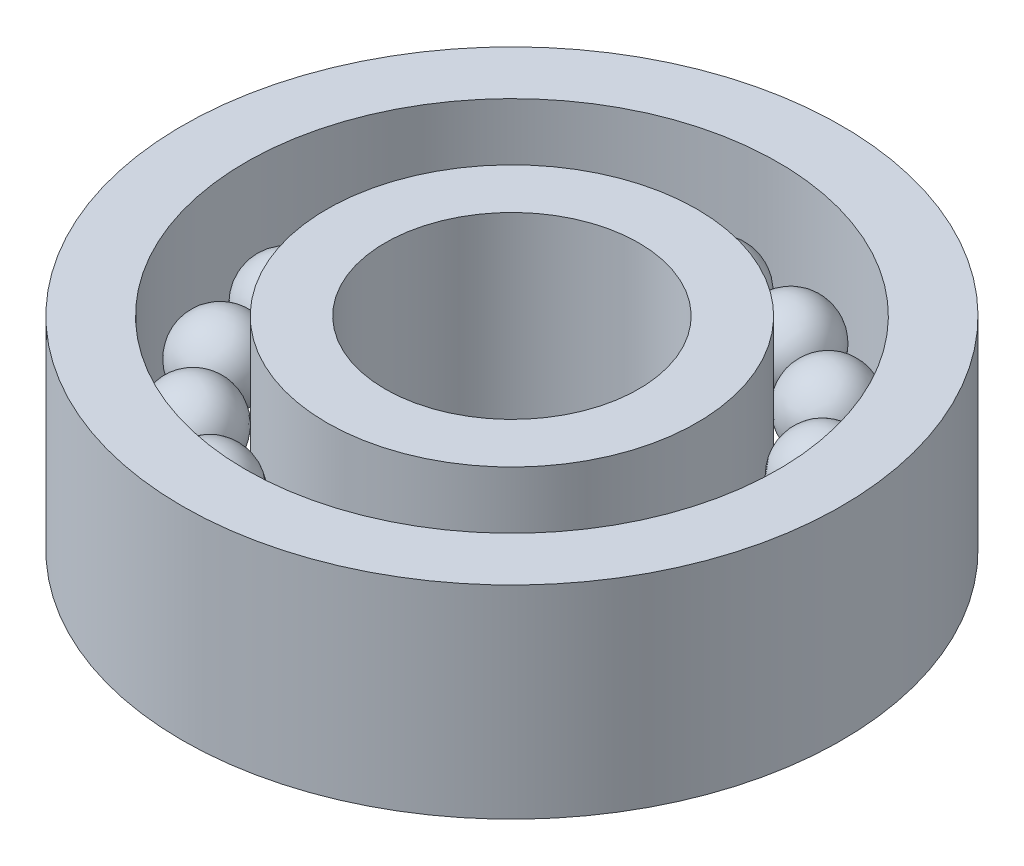
ISO-10303-21;
HEADER;
FILE_DESCRIPTION(('STEP AP214'),'2;1');
FILE_NAME('part.step','',(''),(''),'','','');
FILE_SCHEMA(('AUTOMOTIVE_DESIGN { 1 0 10303 214 1 1 1 1 }'));
ENDSEC;
DATA;
#1=APPLICATION_CONTEXT('core data for automotive mechanical design processes');
#2=APPLICATION_PROTOCOL_DEFINITION('international standard','automotive_design',2000,#1);
#3=PRODUCT_CONTEXT('',#1,'mechanical');
#4=PRODUCT('Part','Part','',(#3));
#5=PRODUCT_RELATED_PRODUCT_CATEGORY('part','',(#4));
#6=PRODUCT_DEFINITION_FORMATION('','',#4);
#7=PRODUCT_DEFINITION_CONTEXT('part definition',#1,'design');
#8=PRODUCT_DEFINITION('design','',#6,#7);
#9=PRODUCT_DEFINITION_SHAPE('','',#8);
#10=(LENGTH_UNIT() NAMED_UNIT(*) SI_UNIT(.MILLI.,.METRE.));
#11=(NAMED_UNIT(*) PLANE_ANGLE_UNIT() SI_UNIT($,.RADIAN.));
#12=(NAMED_UNIT(*) SI_UNIT($,.STERADIAN.) SOLID_ANGLE_UNIT());
#13=UNCERTAINTY_MEASURE_WITH_UNIT(LENGTH_MEASURE(1.E-05),#10,'distance_accuracy_value','');
#14=(GEOMETRIC_REPRESENTATION_CONTEXT(3) GLOBAL_UNCERTAINTY_ASSIGNED_CONTEXT((#13)) GLOBAL_UNIT_ASSIGNED_CONTEXT((#10,
#11,#12)) REPRESENTATION_CONTEXT('',''));
#15=CARTESIAN_POINT('',(0.,0.,0.));
#16=DIRECTION('',(0.,0.,1.));
#17=DIRECTION('',(1.,0.,0.));
#18=AXIS2_PLACEMENT_3D('',#15,#16,#17);
#19=CARTESIAN_POINT('',(-4.1495014208494,0.,1.60752541453278));
#20=DIRECTION('',(-0.361241666187141,0.,-0.932472229404361));
#21=DIRECTION('',(0.932472229404361,0.,-0.361241666187141));
#22=AXIS2_PLACEMENT_3D('',#19,#20,#21);
#23=SPHERICAL_SURFACE('',#22,0.8);
#24=CARTESIAN_POINT('',(-4.43849475379912,0.,0.861547631009287));
#25=VERTEX_POINT('',#24);
#26=VERTEX_LOOP('',#25);
#27=FACE_BOUND('',#26,.T.);
#28=ADVANCED_FACE('F54',(#27),#23,.T.);
#29=CLOSED_SHELL('',(#28));
#30=MANIFOLD_SOLID_BREP('B2',#29);
#31=CARTESIAN_POINT('',(-3.28858968163197,0.,2.99794561422714));
#32=DIRECTION('',(-0.673695643646548,0.,-0.739008917220668));
#33=DIRECTION('',(0.739008917220668,0.,-0.673695643646548));
#34=AXIS2_PLACEMENT_3D('',#31,#32,#33);
#35=SPHERICAL_SURFACE('',#34,0.8);
#36=CARTESIAN_POINT('',(-3.82754619654921,0.,2.4067384804506));
#37=VERTEX_POINT('',#36);
#38=VERTEX_LOOP('',#37);
#39=FACE_BOUND('',#38,.T.);
#40=ADVANCED_FACE('F73',(#39),#35,.T.);
#41=CLOSED_SHELL('',(#40));
#42=MANIFOLD_SOLID_BREP('B7',#41);
#43=CARTESIAN_POINT('',(-1.98353568320564,0.,3.98347664653));
#44=DIRECTION('',(-0.895163291355057,0.,-0.445738355776549));
#45=DIRECTION('',(0.445738355776549,0.,-0.895163291355057));
#46=AXIS2_PLACEMENT_3D('',#43,#44,#45);
#47=SPHERICAL_SURFACE('',#46,0.8);
#48=CARTESIAN_POINT('',(-2.69966631628969,0.,3.62688596190876));
#49=VERTEX_POINT('',#48);
#50=VERTEX_LOOP('',#49);
#51=FACE_BOUND('',#50,.T.);
#52=ADVANCED_FACE('F92',(#51),#47,.T.);
#53=CLOSED_SHELL('',(#52));
#54=MANIFOLD_SOLID_BREP('B50',#53);
#55=CARTESIAN_POINT('',(-0.410594199611743,0.,4.4310170845129));
#56=DIRECTION('',(-0.995734176295033,0.,-0.092268359463313));
#57=DIRECTION('',(0.092268359463313,0.,-0.995734176295033));
#58=AXIS2_PLACEMENT_3D('',#55,#56,#57);
#59=SPHERICAL_SURFACE('',#58,0.8);
#60=CARTESIAN_POINT('',(-1.20718154064777,0.,4.35720239694225));
#61=VERTEX_POINT('',#60);
#62=VERTEX_LOOP('',#61);
#63=FACE_BOUND('',#62,.T.);
#64=ADVANCED_FACE('F111',(#63),#59,.T.);
#65=CLOSED_SHELL('',(#64));
#66=MANIFOLD_SOLID_BREP('B69',#65);
#67=CARTESIAN_POINT('',(1.21780030582072,0.,4.28012411211906));
#68=DIRECTION('',(-0.961825643172822,0.,0.273662990072073));
#69=DIRECTION('',(-0.273662990072073,0.,-0.961825643172822));
#70=AXIS2_PLACEMENT_3D('',#67,#68,#69);
#71=SPHERICAL_SURFACE('',#70,0.8);
#72=CARTESIAN_POINT('',(0.448339791282467,0.,4.49905450417672));
#73=VERTEX_POINT('',#72);
#74=VERTEX_LOOP('',#73);
#75=FACE_BOUND('',#74,.T.);
#76=ADVANCED_FACE('F130',(#75),#71,.T.);
#77=CLOSED_SHELL('',(#76));
#78=MANIFOLD_SOLID_BREP('B88',#77);
#79=CARTESIAN_POINT('',(2.68172413188766,0.,3.55117666139709));
#80=DIRECTION('',(-0.798017227280245,0.,0.602634636379249));
#81=DIRECTION('',(-0.602634636379249,0.,-0.798017227280245));
#82=AXIS2_PLACEMENT_3D('',#79,#80,#81);
#83=SPHERICAL_SURFACE('',#82,0.8);
#84=CARTESIAN_POINT('',(2.04331035006346,0.,4.03328437050049));
#85=VERTEX_POINT('',#84);
#86=VERTEX_LOOP('',#85);
#87=FACE_BOUND('',#86,.T.);
#88=ADVANCED_FACE('F149',(#87),#83,.T.);
#89=CLOSED_SHELL('',(#88));
#90=MANIFOLD_SOLID_BREP('B107',#89);
#91=CARTESIAN_POINT('',(3.78346625399677,0.,2.34262312480426));
#92=DIRECTION('',(-0.526432162877363,0.,0.85021713572961));
#93=DIRECTION('',(-0.85021713572961,0.,-0.526432162877363));
#94=AXIS2_PLACEMENT_3D('',#91,#92,#93);
#95=SPHERICAL_SURFACE('',#94,0.8);
#96=CARTESIAN_POINT('',(3.36232052369487,0.,3.02279683338795));
#97=VERTEX_POINT('',#96);
#98=VERTEX_LOOP('',#97);
#99=FACE_BOUND('',#98,.T.);
#100=ADVANCED_FACE('F168',(#99),#95,.T.);
#101=CLOSED_SHELL('',(#100));
#102=MANIFOLD_SOLID_BREP('B126',#101);
#103=CARTESIAN_POINT('',(4.37423029359336,0.,0.81768535428377));
#104=DIRECTION('',(-0.183749517816578,0.,0.9829730996839));
#105=DIRECTION('',(-0.9829730996839,0.,-0.183749517816578));
#106=AXIS2_PLACEMENT_3D('',#103,#104,#105);
#107=SPHERICAL_SURFACE('',#106,0.8);
#108=CARTESIAN_POINT('',(4.22723067934009,0.,1.60406383403089));
#109=VERTEX_POINT('',#108);
#110=VERTEX_LOOP('',#109);
#111=FACE_BOUND('',#110,.T.);
#112=ADVANCED_FACE('F187',(#111),#107,.T.);
#113=CLOSED_SHELL('',(#112));
#114=MANIFOLD_SOLID_BREP('B145',#113);
#115=CARTESIAN_POINT('',(4.37423029359337,0.,-0.817685354283709));
#116=DIRECTION('',(0.183749517816564,0.,0.982973099683903));
#117=DIRECTION('',(-0.982973099683903,0.,0.183749517816564));
#118=AXIS2_PLACEMENT_3D('',#115,#116,#117);
#119=SPHERICAL_SURFACE('',#118,0.8);
#120=CARTESIAN_POINT('',(4.52122990784662,0.,-0.0313068745365865));
#121=VERTEX_POINT('',#120);
#122=VERTEX_LOOP('',#121);
#123=FACE_BOUND('',#122,.T.);
#124=ADVANCED_FACE('F206',(#123),#119,.T.);
#125=CLOSED_SHELL('',(#124));
#126=MANIFOLD_SOLID_BREP('B164',#125);
#127=CARTESIAN_POINT('',(3.7834662539968,0.,-2.34262312480421));
#128=DIRECTION('',(0.526432162877351,0.,0.850217135729617));
#129=DIRECTION('',(-0.850217135729617,0.,0.526432162877351));
#130=AXIS2_PLACEMENT_3D('',#127,#128,#129);
#131=SPHERICAL_SURFACE('',#130,0.8);
#132=CARTESIAN_POINT('',(4.20461198429868,0.,-1.66244941622052));
#133=VERTEX_POINT('',#132);
#134=VERTEX_LOOP('',#133);
#135=FACE_BOUND('',#134,.T.);
#136=ADVANCED_FACE('F225',(#135),#131,.T.);
#137=CLOSED_SHELL('',(#136));
#138=MANIFOLD_SOLID_BREP('B183',#137);
#139=CARTESIAN_POINT('',(2.68172413188771,0.,-3.55117666139705));
#140=DIRECTION('',(0.798017227280236,0.,0.602634636379261));
#141=DIRECTION('',(-0.602634636379261,0.,0.798017227280236));
#142=AXIS2_PLACEMENT_3D('',#139,#140,#141);
#143=SPHERICAL_SURFACE('',#142,0.8);
#144=CARTESIAN_POINT('',(3.3201379137119,0.,-3.06906895229364));
#145=VERTEX_POINT('',#144);
#146=VERTEX_LOOP('',#145);
#147=FACE_BOUND('',#146,.T.);
#148=ADVANCED_FACE('F244',(#147),#143,.T.);
#149=CLOSED_SHELL('',(#148));
#150=MANIFOLD_SOLID_BREP('B202',#149);
#151=CARTESIAN_POINT('',(1.21780030582079,0.,-4.28012411211904));
#152=DIRECTION('',(0.961825643172818,0.,0.273662990072087));
#153=DIRECTION('',(-0.273662990072087,0.,0.961825643172818));
#154=AXIS2_PLACEMENT_3D('',#151,#152,#153);
#155=SPHERICAL_SURFACE('',#154,0.8);
#156=CARTESIAN_POINT('',(1.98726082035904,0.,-4.06119372006137));
#157=VERTEX_POINT('',#156);
#158=VERTEX_LOOP('',#157);
#159=FACE_BOUND('',#158,.T.);
#160=ADVANCED_FACE('F263',(#159),#155,.T.);
#161=CLOSED_SHELL('',(#160));
#162=MANIFOLD_SOLID_BREP('B221',#161);
#163=CARTESIAN_POINT('',(-0.410594199611679,0.,-4.43101708451291));
#164=DIRECTION('',(0.995734176295035,0.,-0.0922683594632987));
#165=DIRECTION('',(0.0922683594632987,0.,0.995734176295035));
#166=AXIS2_PLACEMENT_3D('',#163,#164,#165);
#167=SPHERICAL_SURFACE('',#166,0.8);
#168=CARTESIAN_POINT('',(0.385993141424349,0.,-4.50483177208354));
#169=VERTEX_POINT('',#168);
#170=VERTEX_LOOP('',#169);
#171=FACE_BOUND('',#170,.T.);
#172=ADVANCED_FACE('F282',(#171),#167,.T.);
#173=CLOSED_SHELL('',(#172));
#174=MANIFOLD_SOLID_BREP('B240',#173);
#175=CARTESIAN_POINT('',(-1.98353568320558,0.,-3.98347664653003));
#176=DIRECTION('',(0.895163291355063,0.,-0.445738355776536));
#177=DIRECTION('',(0.445738355776536,0.,0.895163291355063));
#178=AXIS2_PLACEMENT_3D('',#175,#176,#177);
#179=SPHERICAL_SURFACE('',#178,0.8);
#180=CARTESIAN_POINT('',(-1.26740505012153,0.,-4.34006733115126));
#181=VERTEX_POINT('',#180);
#182=VERTEX_LOOP('',#181);
#183=FACE_BOUND('',#182,.T.);
#184=ADVANCED_FACE('F301',(#183),#179,.T.);
#185=CLOSED_SHELL('',(#184));
#186=MANIFOLD_SOLID_BREP('B259',#185);
#187=CARTESIAN_POINT('',(-3.28858968163193,0.,-2.99794561422718));
#188=DIRECTION('',(0.673695643646558,0.,-0.739008917220658));
#189=DIRECTION('',(0.739008917220658,0.,0.673695643646558));
#190=AXIS2_PLACEMENT_3D('',#187,#188,#189);
#191=SPHERICAL_SURFACE('',#190,0.8);
#192=CARTESIAN_POINT('',(-2.74963316671468,0.,-3.58915274800371));
#193=VERTEX_POINT('',#192);
#194=VERTEX_LOOP('',#193);
#195=FACE_BOUND('',#194,.T.);
#196=ADVANCED_FACE('F320',(#195),#191,.T.);
#197=CLOSED_SHELL('',(#196));
#198=MANIFOLD_SOLID_BREP('B278',#197);
#199=CARTESIAN_POINT('',(-4.14950142084938,0.,-1.60752541453283));
#200=DIRECTION('',(0.361241666187154,0.,-0.932472229404355));
#201=DIRECTION('',(0.932472229404355,0.,0.361241666187154));
#202=AXIS2_PLACEMENT_3D('',#199,#200,#201);
#203=SPHERICAL_SURFACE('',#202,0.8);
#204=CARTESIAN_POINT('',(-3.86050808789966,0.,-2.35350319805632));
#205=VERTEX_POINT('',#204);
#206=VERTEX_LOOP('',#205);
#207=FACE_BOUND('',#206,.T.);
#208=ADVANCED_FACE('F339',(#207),#203,.T.);
#209=CLOSED_SHELL('',(#208));
#210=MANIFOLD_SOLID_BREP('B297',#209);
#211=CARTESIAN_POINT('',(-4.45,0.,0.));
#212=DIRECTION('',(0.,0.,-1.));
#213=DIRECTION('',(1.,0.,0.));
#214=AXIS2_PLACEMENT_3D('',#211,#212,#213);
#215=SPHERICAL_SURFACE('',#214,0.8);
#216=CARTESIAN_POINT('',(-4.45,0.,-0.8));
#217=VERTEX_POINT('',#216);
#218=VERTEX_LOOP('',#217);
#219=FACE_BOUND('',#218,.T.);
#220=ADVANCED_FACE('F362',(#219),#215,.T.);
#221=CLOSED_SHELL('',(#220));
#222=MANIFOLD_SOLID_BREP('B316',#221);
#223=CARTESIAN_POINT('',(0.,2.,0.));
#224=DIRECTION('',(0.,1.,0.));
#225=DIRECTION('',(0.,0.,1.));
#226=AXIS2_PLACEMENT_3D('',#223,#224,#225);
#227=PLANE('',#226);
#228=CARTESIAN_POINT('',(0.,2.,0.));
#229=DIRECTION('',(0.,1.,0.));
#230=DIRECTION('',(0.,0.,1.));
#231=AXIS2_PLACEMENT_3D('',#228,#229,#230);
#232=CIRCLE('',#231,5.25);
#233=CARTESIAN_POINT('',(0.,2.,5.25));
#234=VERTEX_POINT('',#233);
#235=EDGE_CURVE('E360',#234,#234,#232,.T.);
#236=ORIENTED_EDGE('',*,*,#235,.F.);
#237=EDGE_LOOP('',(#236));
#238=FACE_BOUND('',#237,.T.);
#239=CARTESIAN_POINT('',(0.,2.,0.));
#240=DIRECTION('',(0.,1.,0.));
#241=DIRECTION('',(0.,0.,1.));
#242=AXIS2_PLACEMENT_3D('',#239,#240,#241);
#243=CIRCLE('',#242,6.5);
#244=CARTESIAN_POINT('',(0.,2.,6.5));
#245=VERTEX_POINT('',#244);
#246=EDGE_CURVE('E410',#245,#245,#243,.T.);
#247=ORIENTED_EDGE('',*,*,#246,.T.);
#248=EDGE_LOOP('',(#247));
#249=FACE_BOUND('',#248,.T.);
#250=ADVANCED_FACE('F384',(#238,#249),#227,.T.);
#251=CARTESIAN_POINT('',(0.,-2.,0.));
#252=DIRECTION('',(0.,1.,0.));
#253=DIRECTION('',(0.,0.,1.));
#254=AXIS2_PLACEMENT_3D('',#251,#252,#253);
#255=PLANE('',#254);
#256=CARTESIAN_POINT('',(0.,-2.,0.));
#257=DIRECTION('',(0.,1.,0.));
#258=DIRECTION('',(0.,0.,1.));
#259=AXIS2_PLACEMENT_3D('',#256,#257,#258);
#260=CIRCLE('',#259,5.25);
#261=CARTESIAN_POINT('',(0.,-2.,5.25));
#262=VERTEX_POINT('',#261);
#263=EDGE_CURVE('E388',#262,#262,#260,.T.);
#264=ORIENTED_EDGE('',*,*,#263,.T.);
#265=EDGE_LOOP('',(#264));
#266=FACE_BOUND('',#265,.T.);
#267=CARTESIAN_POINT('',(0.,-2.,0.));
#268=DIRECTION('',(0.,1.,0.));
#269=DIRECTION('',(0.,0.,1.));
#270=AXIS2_PLACEMENT_3D('',#267,#268,#269);
#271=CIRCLE('',#270,6.5);
#272=CARTESIAN_POINT('',(0.,-2.,6.5));
#273=VERTEX_POINT('',#272);
#274=EDGE_CURVE('E393',#273,#273,#271,.T.);
#275=ORIENTED_EDGE('',*,*,#274,.F.);
#276=EDGE_LOOP('',(#275));
#277=FACE_BOUND('',#276,.T.);
#278=ADVANCED_FACE('F386',(#266,#277),#255,.F.);
#279=CARTESIAN_POINT('',(0.,2.,0.));
#280=DIRECTION('',(0.,-1.,0.));
#281=DIRECTION('',(0.,0.,-1.));
#282=AXIS2_PLACEMENT_3D('',#279,#280,#281);
#283=CYLINDRICAL_SURFACE('',#282,6.5);
#284=ORIENTED_EDGE('',*,*,#246,.F.);
#285=EDGE_LOOP('',(#284));
#286=FACE_BOUND('',#285,.T.);
#287=ORIENTED_EDGE('',*,*,#274,.T.);
#288=EDGE_LOOP('',(#287));
#289=FACE_BOUND('',#288,.T.);
#290=ADVANCED_FACE('F399',(#286,#289),#283,.T.);
#291=CARTESIAN_POINT('',(0.,-2.,0.));
#292=DIRECTION('',(0.,1.,0.));
#293=DIRECTION('',(0.,0.,1.));
#294=AXIS2_PLACEMENT_3D('',#291,#292,#293);
#295=CYLINDRICAL_SURFACE('',#294,5.25);
#296=CARTESIAN_POINT('',(-5.25,0.,0.));
#297=VERTEX_POINT('',#296);
#298=VERTEX_LOOP('',#297);
#299=FACE_BOUND('',#298,.T.);
#300=ORIENTED_EDGE('',*,*,#263,.F.);
#301=EDGE_LOOP('',(#300));
#302=FACE_BOUND('',#301,.T.);
#303=ORIENTED_EDGE('',*,*,#235,.T.);
#304=EDGE_LOOP('',(#303));
#305=FACE_BOUND('',#304,.T.);
#306=ADVANCED_FACE('F396',(#299,#302,#305),#295,.F.);
#307=CLOSED_SHELL('',(#250,#278,#290,#306));
#308=MANIFOLD_SOLID_BREP('B335',#307);
#309=CARTESIAN_POINT('',(0.,2.,0.));
#310=DIRECTION('',(0.,1.,0.));
#311=DIRECTION('',(0.,0.,1.));
#312=AXIS2_PLACEMENT_3D('',#309,#310,#311);
#313=PLANE('',#312);
#314=CARTESIAN_POINT('',(0.,2.,0.));
#315=DIRECTION('',(0.,1.,0.));
#316=DIRECTION('',(0.,0.,1.));
#317=AXIS2_PLACEMENT_3D('',#314,#315,#316);
#318=CIRCLE('',#317,2.5);
#319=CARTESIAN_POINT('',(0.,2.,2.5));
#320=VERTEX_POINT('',#319);
#321=EDGE_CURVE('E382',#320,#320,#318,.T.);
#322=ORIENTED_EDGE('',*,*,#321,.F.);
#323=EDGE_LOOP('',(#322));
#324=FACE_BOUND('',#323,.T.);
#325=CARTESIAN_POINT('',(0.,2.,0.));
#326=DIRECTION('',(0.,1.,0.));
#327=DIRECTION('',(0.,0.,1.));
#328=AXIS2_PLACEMENT_3D('',#325,#326,#327);
#329=CIRCLE('',#328,3.65);
#330=CARTESIAN_POINT('',(0.,2.,3.65));
#331=VERTEX_POINT('',#330);
#332=EDGE_CURVE('E470',#331,#331,#329,.T.);
#333=ORIENTED_EDGE('',*,*,#332,.T.);
#334=EDGE_LOOP('',(#333));
#335=FACE_BOUND('',#334,.T.);
#336=ADVANCED_FACE('F450',(#324,#335),#313,.T.);
#337=CARTESIAN_POINT('',(0.,2.,0.));
#338=DIRECTION('',(0.,-1.,0.));
#339=DIRECTION('',(0.,0.,-1.));
#340=AXIS2_PLACEMENT_3D('',#337,#338,#339);
#341=CYLINDRICAL_SURFACE('',#340,2.5);
#342=ORIENTED_EDGE('',*,*,#321,.T.);
#343=EDGE_LOOP('',(#342));
#344=FACE_BOUND('',#343,.T.);
#345=CARTESIAN_POINT('',(0.,-2.,0.));
#346=DIRECTION('',(0.,1.,0.));
#347=DIRECTION('',(0.,0.,1.));
#348=AXIS2_PLACEMENT_3D('',#345,#346,#347);
#349=CIRCLE('',#348,2.5);
#350=CARTESIAN_POINT('',(0.,-2.,2.5));
#351=VERTEX_POINT('',#350);
#352=EDGE_CURVE('E454',#351,#351,#349,.T.);
#353=ORIENTED_EDGE('',*,*,#352,.F.);
#354=EDGE_LOOP('',(#353));
#355=FACE_BOUND('',#354,.T.);
#356=ADVANCED_FACE('F479',(#344,#355),#341,.F.);
#357=CARTESIAN_POINT('',(0.,-2.,0.));
#358=DIRECTION('',(0.,1.,0.));
#359=DIRECTION('',(0.,0.,1.));
#360=AXIS2_PLACEMENT_3D('',#357,#358,#359);
#361=PLANE('',#360);
#362=ORIENTED_EDGE('',*,*,#352,.T.);
#363=EDGE_LOOP('',(#362));
#364=FACE_BOUND('',#363,.T.);
#365=CARTESIAN_POINT('',(0.,-2.,0.));
#366=DIRECTION('',(0.,1.,0.));
#367=DIRECTION('',(0.,0.,1.));
#368=AXIS2_PLACEMENT_3D('',#365,#366,#367);
#369=CIRCLE('',#368,3.65);
#370=CARTESIAN_POINT('',(0.,-2.,3.65));
#371=VERTEX_POINT('',#370);
#372=EDGE_CURVE('E467',#371,#371,#369,.T.);
#373=ORIENTED_EDGE('',*,*,#372,.F.);
#374=EDGE_LOOP('',(#373));
#375=FACE_BOUND('',#374,.T.);
#376=ADVANCED_FACE('F452',(#364,#375),#361,.F.);
#377=CARTESIAN_POINT('',(0.,-2.,0.));
#378=DIRECTION('',(0.,1.,0.));
#379=DIRECTION('',(0.,0.,1.));
#380=AXIS2_PLACEMENT_3D('',#377,#378,#379);
#381=CYLINDRICAL_SURFACE('',#380,3.65);
#382=CARTESIAN_POINT('',(-3.65,0.,0.));
#383=VERTEX_POINT('',#382);
#384=VERTEX_LOOP('',#383);
#385=FACE_BOUND('',#384,.T.);
#386=ORIENTED_EDGE('',*,*,#372,.T.);
#387=EDGE_LOOP('',(#386));
#388=FACE_BOUND('',#387,.T.);
#389=ORIENTED_EDGE('',*,*,#332,.F.);
#390=EDGE_LOOP('',(#389));
#391=FACE_BOUND('',#390,.T.);
#392=ADVANCED_FACE('F460',(#385,#388,#391),#381,.T.);
#393=CLOSED_SHELL('',(#336,#356,#376,#392));
#394=MANIFOLD_SOLID_BREP('B354',#393);
#395=ADVANCED_BREP_SHAPE_REPRESENTATION('',(#18,#30,#42,#54,#66,#78,#90,#102,#114,#126,#138,
#150,#162,#174,#186,#198,#210,#222,#308,#394),#14);
#396=SHAPE_DEFINITION_REPRESENTATION(#9,#395);
ENDSEC;
END-ISO-10303-21;
